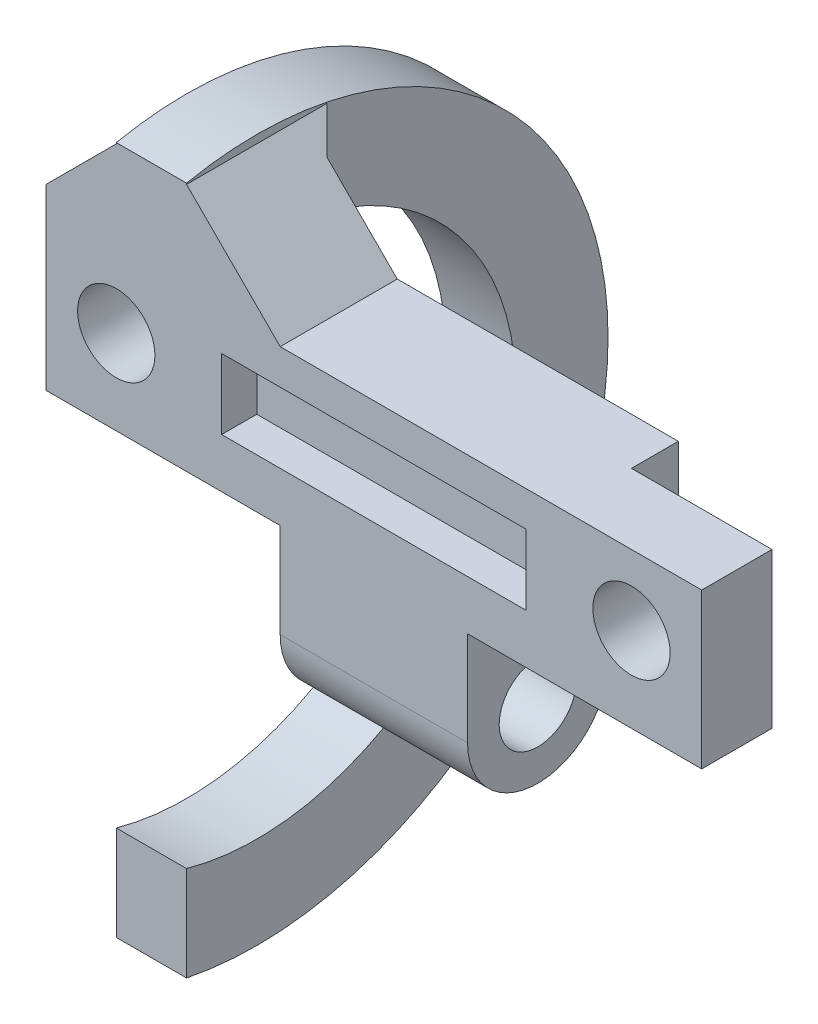
ISO-10303-21;
HEADER;
FILE_DESCRIPTION(('STEP AP214'),'2;1');
FILE_NAME('part.step','',(''),(''),'','','');
FILE_SCHEMA(('AUTOMOTIVE_DESIGN { 1 0 10303 214 1 1 1 1 }'));
ENDSEC;
DATA;
#1=APPLICATION_CONTEXT('core data for automotive mechanical design processes');
#2=APPLICATION_PROTOCOL_DEFINITION('international standard','automotive_design',2000,#1);
#3=PRODUCT_CONTEXT('',#1,'mechanical');
#4=PRODUCT('Part','Part','',(#3));
#5=PRODUCT_RELATED_PRODUCT_CATEGORY('part','',(#4));
#6=PRODUCT_DEFINITION_FORMATION('','',#4);
#7=PRODUCT_DEFINITION_CONTEXT('part definition',#1,'design');
#8=PRODUCT_DEFINITION('design','',#6,#7);
#9=PRODUCT_DEFINITION_SHAPE('','',#8);
#10=(LENGTH_UNIT() NAMED_UNIT(*) SI_UNIT(.MILLI.,.METRE.));
#11=(NAMED_UNIT(*) PLANE_ANGLE_UNIT() SI_UNIT($,.RADIAN.));
#12=(NAMED_UNIT(*) SI_UNIT($,.STERADIAN.) SOLID_ANGLE_UNIT());
#13=UNCERTAINTY_MEASURE_WITH_UNIT(LENGTH_MEASURE(1.E-05),#10,'distance_accuracy_value','');
#14=(GEOMETRIC_REPRESENTATION_CONTEXT(3) GLOBAL_UNCERTAINTY_ASSIGNED_CONTEXT((#13)) GLOBAL_UNIT_ASSIGNED_CONTEXT((#10,
#11,#12)) REPRESENTATION_CONTEXT('',''));
#15=CARTESIAN_POINT('',(0.,0.,0.));
#16=DIRECTION('',(0.,0.,1.));
#17=DIRECTION('',(1.,0.,0.));
#18=AXIS2_PLACEMENT_3D('',#15,#16,#17);
#19=CARTESIAN_POINT('',(4.,-3.61575197548495,-3.16233039336618));
#20=DIRECTION('',(0.,-1.,0.));
#21=DIRECTION('',(0.,0.,-1.));
#22=AXIS2_PLACEMENT_3D('',#19,#20,#21);
#23=PLANE('',#22);
#24=DIRECTION('',(0.,0.,-1.));
#25=VECTOR('',#24,1.);
#26=CARTESIAN_POINT('',(4.,-3.61575197548495,-3.16233039336618));
#27=LINE('',#26,#25);
#28=CARTESIAN_POINT('',(4.,-3.61575197548495,3.));
#29=VERTEX_POINT('',#28);
#30=CARTESIAN_POINT('',(4.,-3.61575197548495,-2.));
#31=VERTEX_POINT('',#30);
#32=EDGE_CURVE('E203',#29,#31,#27,.T.);
#33=ORIENTED_EDGE('',*,*,#32,.T.);
#34=DIRECTION('',(-1.,0.,0.));
#35=VECTOR('',#34,1.);
#36=CARTESIAN_POINT('',(8.,-3.61575197548495,-2.));
#37=LINE('',#36,#35);
#38=CARTESIAN_POINT('',(8.,-3.61575197548495,-2.));
#39=VERTEX_POINT('',#38);
#40=EDGE_CURVE('E207',#39,#31,#37,.T.);
#41=ORIENTED_EDGE('',*,*,#40,.F.);
#42=DIRECTION('',(0.,0.,1.));
#43=VECTOR('',#42,1.);
#44=CARTESIAN_POINT('',(8.,-3.61575197548495,-2.));
#45=LINE('',#44,#43);
#46=CARTESIAN_POINT('',(8.,-3.61575197548495,0.));
#47=VERTEX_POINT('',#46);
#48=EDGE_CURVE('E233',#39,#47,#45,.T.);
#49=ORIENTED_EDGE('',*,*,#48,.T.);
#50=DIRECTION('',(1.,0.,0.));
#51=VECTOR('',#50,1.);
#52=CARTESIAN_POINT('',(4.,-3.61575197548495,0.));
#53=LINE('',#52,#51);
#54=CARTESIAN_POINT('',(14.,-3.61575197548495,0.));
#55=VERTEX_POINT('',#54);
#56=EDGE_CURVE('E322',#47,#55,#53,.T.);
#57=ORIENTED_EDGE('',*,*,#56,.T.);
#58=DIRECTION('',(0.,0.,-1.));
#59=VECTOR('',#58,1.);
#60=CARTESIAN_POINT('',(14.,-3.61575197548495,-3.16233039336618));
#61=LINE('',#60,#59);
#62=CARTESIAN_POINT('',(14.,-3.61575197548495,3.));
#63=VERTEX_POINT('',#62);
#64=EDGE_CURVE('E324',#63,#55,#61,.T.);
#65=ORIENTED_EDGE('',*,*,#64,.F.);
#66=DIRECTION('',(1.,0.,0.));
#67=VECTOR('',#66,1.);
#68=CARTESIAN_POINT('',(4.,-3.61575197548495,3.));
#69=LINE('',#68,#67);
#70=EDGE_CURVE('E209',#29,#63,#69,.T.);
#71=ORIENTED_EDGE('',*,*,#70,.F.);
#72=EDGE_LOOP('',(#33,#41,#49,#57,#65,#71));
#73=FACE_BOUND('',#72,.T.);
#74=ADVANCED_FACE('F33',(#73),#23,.T.);
#75=CARTESIAN_POINT('',(-4.,-3.61575197548495,-2.));
#76=VERTEX_POINT('',#75);
#77=CARTESIAN_POINT('',(-8.,-3.61575197548495,-2.));
#78=VERTEX_POINT('',#77);
#79=EDGE_CURVE('E230',#76,#78,#37,.T.);
#80=ORIENTED_EDGE('',*,*,#79,.F.);
#81=DIRECTION('',(0.,0.,-1.));
#82=VECTOR('',#81,1.);
#83=CARTESIAN_POINT('',(-4.,-3.61575197548495,-3.16233039336618));
#84=LINE('',#83,#82);
#85=CARTESIAN_POINT('',(-4.,-3.61575197548495,3.));
#86=VERTEX_POINT('',#85);
#87=EDGE_CURVE('E48',#86,#76,#84,.T.);
#88=ORIENTED_EDGE('',*,*,#87,.F.);
#89=DIRECTION('',(-1.,0.,0.));
#90=VECTOR('',#89,1.);
#91=CARTESIAN_POINT('',(-4.,-3.61575197548495,3.));
#92=LINE('',#91,#90);
#93=CARTESIAN_POINT('',(-14.,-3.61575197548495,3.));
#94=VERTEX_POINT('',#93);
#95=EDGE_CURVE('E335',#86,#94,#92,.T.);
#96=ORIENTED_EDGE('',*,*,#95,.T.);
#97=DIRECTION('',(0.,0.,-1.));
#98=VECTOR('',#97,1.);
#99=CARTESIAN_POINT('',(-14.,-3.61575197548495,-3.16233039336618));
#100=LINE('',#99,#98);
#101=CARTESIAN_POINT('',(-14.,-3.61575197548495,0.));
#102=VERTEX_POINT('',#101);
#103=EDGE_CURVE('E331',#94,#102,#100,.T.);
#104=ORIENTED_EDGE('',*,*,#103,.T.);
#105=DIRECTION('',(-1.,0.,0.));
#106=VECTOR('',#105,1.);
#107=CARTESIAN_POINT('',(-4.,-3.61575197548495,0.));
#108=LINE('',#107,#106);
#109=CARTESIAN_POINT('',(-8.,-3.61575197548495,0.));
#110=VERTEX_POINT('',#109);
#111=EDGE_CURVE('E314',#110,#102,#108,.T.);
#112=ORIENTED_EDGE('',*,*,#111,.F.);
#113=DIRECTION('',(0.,0.,1.));
#114=VECTOR('',#113,1.);
#115=CARTESIAN_POINT('',(-8.,-3.61575197548495,-2.));
#116=LINE('',#115,#114);
#117=EDGE_CURVE('E229',#78,#110,#116,.T.);
#118=ORIENTED_EDGE('',*,*,#117,.F.);
#119=EDGE_LOOP('',(#80,#88,#96,#104,#112,#118));
#120=FACE_BOUND('',#119,.T.);
#121=ADVANCED_FACE('F467',(#120),#23,.T.);
#122=CARTESIAN_POINT('',(0.,0.,0.));
#123=DIRECTION('',(0.,0.,1.));
#124=DIRECTION('',(1.,0.,0.));
#125=AXIS2_PLACEMENT_3D('',#122,#123,#124);
#126=PLANE('',#125);
#127=CARTESIAN_POINT('',(-11.,0.,0.));
#128=DIRECTION('',(0.,0.,1.));
#129=DIRECTION('',(1.,0.,0.));
#130=AXIS2_PLACEMENT_3D('',#127,#128,#129);
#131=CIRCLE('',#130,1.65);
#132=CARTESIAN_POINT('',(-9.35,0.,0.));
#133=VERTEX_POINT('',#132);
#134=EDGE_CURVE('E346',#133,#133,#131,.T.);
#135=ORIENTED_EDGE('',*,*,#134,.T.);
#136=EDGE_LOOP('',(#135));
#137=FACE_BOUND('',#136,.T.);
#138=DIRECTION('',(-0.707106781186551,-0.707106781186544,0.));
#139=VECTOR('',#138,1.);
#140=CARTESIAN_POINT('',(-8.99999999999996,9.00000000000005,0.));
#141=LINE('',#140,#139);
#142=CARTESIAN_POINT('',(-14.,4.00000000000006,0.));
#143=VERTEX_POINT('',#142);
#144=CARTESIAN_POINT('',(-12.,6.00000000000005,0.));
#145=VERTEX_POINT('',#144);
#146=EDGE_CURVE('E392',#143,#145,#141,.F.);
#147=ORIENTED_EDGE('',*,*,#146,.T.);
#148=DIRECTION('',(0.,-1.,0.));
#149=VECTOR('',#148,1.);
#150=CARTESIAN_POINT('',(-12.,0.,0.));
#151=LINE('',#150,#149);
#152=CARTESIAN_POINT('',(-12.,3.,0.));
#153=VERTEX_POINT('',#152);
#154=EDGE_CURVE('E414',#145,#153,#151,.T.);
#155=ORIENTED_EDGE('',*,*,#154,.T.);
#156=DIRECTION('',(-1.,0.,0.));
#157=VECTOR('',#156,1.);
#158=CARTESIAN_POINT('',(-14.,3.,0.));
#159=LINE('',#158,#157);
#160=CARTESIAN_POINT('',(-8.,3.,0.));
#161=VERTEX_POINT('',#160);
#162=EDGE_CURVE('E55',#161,#153,#159,.T.);
#163=ORIENTED_EDGE('',*,*,#162,.F.);
#164=DIRECTION('',(0.,1.,0.));
#165=VECTOR('',#164,1.);
#166=CARTESIAN_POINT('',(-8.,7.00000000000002,0.));
#167=LINE('',#166,#165);
#168=EDGE_CURVE('E238',#110,#161,#167,.T.);
#169=ORIENTED_EDGE('',*,*,#168,.F.);
#170=ORIENTED_EDGE('',*,*,#111,.T.);
#171=DIRECTION('',(0.,-1.,0.));
#172=VECTOR('',#171,1.);
#173=CARTESIAN_POINT('',(-14.,3.,0.));
#174=LINE('',#173,#172);
#175=EDGE_CURVE('E362',#143,#102,#174,.T.);
#176=ORIENTED_EDGE('',*,*,#175,.F.);
#177=EDGE_LOOP('',(#147,#155,#163,#169,#170,#176));
#178=FACE_BOUND('',#177,.T.);
#179=ADVANCED_FACE('F424',(#137,#178),#126,.F.);
#180=CARTESIAN_POINT('',(11.,0.,0.));
#181=DIRECTION('',(0.,0.,1.));
#182=DIRECTION('',(1.,0.,0.));
#183=AXIS2_PLACEMENT_3D('',#180,#181,#182);
#184=CIRCLE('',#183,1.65);
#185=CARTESIAN_POINT('',(12.65,0.,0.));
#186=VERTEX_POINT('',#185);
#187=EDGE_CURVE('E350',#186,#186,#184,.T.);
#188=ORIENTED_EDGE('',*,*,#187,.T.);
#189=EDGE_LOOP('',(#188));
#190=FACE_BOUND('',#189,.T.);
#191=DIRECTION('',(0.,-1.,0.));
#192=VECTOR('',#191,1.);
#193=CARTESIAN_POINT('',(8.,3.,0.));
#194=LINE('',#193,#192);
#195=CARTESIAN_POINT('',(8.,3.,0.));
#196=VERTEX_POINT('',#195);
#197=EDGE_CURVE('E241',#196,#47,#194,.T.);
#198=ORIENTED_EDGE('',*,*,#197,.F.);
#199=CARTESIAN_POINT('',(14.,3.,0.));
#200=VERTEX_POINT('',#199);
#201=EDGE_CURVE('E369',#200,#196,#159,.T.);
#202=ORIENTED_EDGE('',*,*,#201,.F.);
#203=DIRECTION('',(0.,1.,0.));
#204=VECTOR('',#203,1.);
#205=CARTESIAN_POINT('',(14.,3.,0.));
#206=LINE('',#205,#204);
#207=EDGE_CURVE('E356',#55,#200,#206,.T.);
#208=ORIENTED_EDGE('',*,*,#207,.F.);
#209=ORIENTED_EDGE('',*,*,#56,.F.);
#210=EDGE_LOOP('',(#198,#202,#208,#209));
#211=FACE_BOUND('',#210,.T.);
#212=ADVANCED_FACE('F507',(#190,#211),#126,.F.);
#213=CARTESIAN_POINT('',(-4.,0.,0.));
#214=DIRECTION('',(1.,0.,0.));
#215=DIRECTION('',(0.,0.,-1.));
#216=AXIS2_PLACEMENT_3D('',#213,#214,#215);
#217=PLANE('',#216);
#218=DIRECTION('',(0.,-1.,0.));
#219=VECTOR('',#218,1.);
#220=CARTESIAN_POINT('',(-4.,-3.61575197548495,-2.));
#221=LINE('',#220,#219);
#222=CARTESIAN_POINT('',(-4.,-5.4139320225002,-2.));
#223=VERTEX_POINT('',#222);
#224=EDGE_CURVE('E222',#76,#223,#221,.T.);
#225=ORIENTED_EDGE('',*,*,#224,.T.);
#226=CARTESIAN_POINT('',(-4.,-7.64999999999999,0.));
#227=DIRECTION('',(1.,0.,0.));
#228=DIRECTION('',(0.,0.,-1.));
#229=AXIS2_PLACEMENT_3D('',#226,#227,#228);
#230=CIRCLE('',#229,3.);
#231=CARTESIAN_POINT('',(-4.,-7.65,3.));
#232=VERTEX_POINT('',#231);
#233=EDGE_CURVE('E341',#223,#232,#230,.F.);
#234=ORIENTED_EDGE('',*,*,#233,.T.);
#235=DIRECTION('',(0.,1.,0.));
#236=VECTOR('',#235,1.);
#237=CARTESIAN_POINT('',(-4.,-3.61575197548495,3.));
#238=LINE('',#237,#236);
#239=EDGE_CURVE('E332',#232,#86,#238,.T.);
#240=ORIENTED_EDGE('',*,*,#239,.T.);
#241=ORIENTED_EDGE('',*,*,#87,.T.);
#242=EDGE_LOOP('',(#225,#234,#240,#241));
#243=FACE_BOUND('',#242,.T.);
#244=CARTESIAN_POINT('',(-4.,-7.64999999999999,0.));
#245=DIRECTION('',(1.,0.,0.));
#246=DIRECTION('',(0.,0.,-1.));
#247=AXIS2_PLACEMENT_3D('',#244,#245,#246);
#248=CIRCLE('',#247,1.65);
#249=CARTESIAN_POINT('',(-4.,-7.64999999999999,-1.65));
#250=VERTEX_POINT('',#249);
#251=EDGE_CURVE('E340',#250,#250,#248,.F.);
#252=ORIENTED_EDGE('',*,*,#251,.F.);
#253=EDGE_LOOP('',(#252));
#254=FACE_BOUND('',#253,.T.);
#255=ADVANCED_FACE('F456',(#243,#254),#217,.F.);
#256=CARTESIAN_POINT('',(4.,0.,0.));
#257=DIRECTION('',(-1.,0.,0.));
#258=DIRECTION('',(0.,0.,-1.));
#259=AXIS2_PLACEMENT_3D('',#256,#257,#258);
#260=PLANE('',#259);
#261=DIRECTION('',(0.,1.,0.));
#262=VECTOR('',#261,1.);
#263=CARTESIAN_POINT('',(4.,-3.61575197548495,-2.));
#264=LINE('',#263,#262);
#265=CARTESIAN_POINT('',(4.,-5.41393202250021,-2.));
#266=VERTEX_POINT('',#265);
#267=EDGE_CURVE('E215',#266,#31,#264,.T.);
#268=ORIENTED_EDGE('',*,*,#267,.T.);
#269=ORIENTED_EDGE('',*,*,#32,.F.);
#270=DIRECTION('',(0.,1.,0.));
#271=VECTOR('',#270,1.);
#272=CARTESIAN_POINT('',(4.,-3.61575197548495,3.));
#273=LINE('',#272,#271);
#274=CARTESIAN_POINT('',(4.,-7.65,3.));
#275=VERTEX_POINT('',#274);
#276=EDGE_CURVE('E212',#275,#29,#273,.T.);
#277=ORIENTED_EDGE('',*,*,#276,.F.);
#278=CARTESIAN_POINT('',(4.,-7.65,0.));
#279=DIRECTION('',(-1.,0.,0.));
#280=DIRECTION('',(0.,0.,1.));
#281=AXIS2_PLACEMENT_3D('',#278,#279,#280);
#282=CIRCLE('',#281,3.);
#283=EDGE_CURVE('E219',#275,#266,#282,.F.);
#284=ORIENTED_EDGE('',*,*,#283,.T.);
#285=EDGE_LOOP('',(#268,#269,#277,#284));
#286=FACE_BOUND('',#285,.T.);
#287=CARTESIAN_POINT('',(4.,-7.65,0.));
#288=DIRECTION('',(-1.,0.,0.));
#289=DIRECTION('',(0.,0.,1.));
#290=AXIS2_PLACEMENT_3D('',#287,#288,#289);
#291=CIRCLE('',#290,1.65);
#292=CARTESIAN_POINT('',(4.,-7.65,1.65));
#293=VERTEX_POINT('',#292);
#294=EDGE_CURVE('E329',#293,#293,#291,.F.);
#295=ORIENTED_EDGE('',*,*,#294,.F.);
#296=EDGE_LOOP('',(#295));
#297=FACE_BOUND('',#296,.T.);
#298=ADVANCED_FACE('F216',(#286,#297),#260,.F.);
#299=CARTESIAN_POINT('',(-8.,-7.64999999999999,0.));
#300=DIRECTION('',(-1.,0.,0.));
#301=DIRECTION('',(0.,0.,1.));
#302=AXIS2_PLACEMENT_3D('',#299,#300,#301);
#303=PLANE('',#302);
#304=DIRECTION('',(0.,0.,-1.));
#305=VECTOR('',#304,1.);
#306=CARTESIAN_POINT('',(-8.,7.00000000000002,0.));
#307=LINE('',#306,#305);
#308=CARTESIAN_POINT('',(-8.,7.00000000000002,3.));
#309=VERTEX_POINT('',#308);
#310=CARTESIAN_POINT('',(-8.,7.00000000000002,-3.00000000000001));
#311=VERTEX_POINT('',#310);
#312=EDGE_CURVE('E376',#309,#311,#307,.T.);
#313=ORIENTED_EDGE('',*,*,#312,.T.);
#314=DIRECTION('',(0.,-1.,0.));
#315=VECTOR('',#314,1.);
#316=CARTESIAN_POINT('',(-8.,-7.64999999999999,-3.00000000000001));
#317=LINE('',#316,#315);
#318=CARTESIAN_POINT('',(-8.,3.,-3.));
#319=VERTEX_POINT('',#318);
#320=EDGE_CURVE('E398',#311,#319,#317,.T.);
#321=ORIENTED_EDGE('',*,*,#320,.T.);
#322=CARTESIAN_POINT('',(-8.,-7.64999999999999,0.));
#323=DIRECTION('',(1.,0.,0.));
#324=DIRECTION('',(0.,0.,1.));
#325=AXIS2_PLACEMENT_3D('',#322,#323,#324);
#326=CIRCLE('',#325,11.064470163546);
#327=CARTESIAN_POINT('',(-8.,-18.3,3.));
#328=VERTEX_POINT('',#327);
#329=EDGE_CURVE('E273',#328,#319,#326,.T.);
#330=ORIENTED_EDGE('',*,*,#329,.F.);
#331=DIRECTION('',(0.,1.,0.));
#332=VECTOR('',#331,1.);
#333=CARTESIAN_POINT('',(-8.,-18.3,3.));
#334=LINE('',#333,#332);
#335=CARTESIAN_POINT('',(-8.,-22.3469384566991,3.));
#336=VERTEX_POINT('',#335);
#337=EDGE_CURVE('E270',#336,#328,#334,.T.);
#338=ORIENTED_EDGE('',*,*,#337,.F.);
#339=CARTESIAN_POINT('',(-8.,-7.64999999999999,0.));
#340=DIRECTION('',(-1.,0.,0.));
#341=DIRECTION('',(0.,0.,1.));
#342=AXIS2_PLACEMENT_3D('',#339,#340,#341);
#343=CIRCLE('',#342,15.);
#344=CARTESIAN_POINT('',(-8.,7.04693845669908,3.));
#345=VERTEX_POINT('',#344);
#346=EDGE_CURVE('E267',#345,#336,#343,.T.);
#347=ORIENTED_EDGE('',*,*,#346,.F.);
#348=DIRECTION('',(0.,1.,0.));
#349=VECTOR('',#348,1.);
#350=CARTESIAN_POINT('',(-8.,3.,3.));
#351=LINE('',#350,#349);
#352=EDGE_CURVE('E265',#309,#345,#351,.T.);
#353=ORIENTED_EDGE('',*,*,#352,.F.);
#354=EDGE_LOOP('',(#313,#321,#330,#338,#347,#353));
#355=FACE_BOUND('',#354,.T.);
#356=ADVANCED_FACE('F483',(#355),#303,.F.);
#357=CARTESIAN_POINT('',(-14.,3.,3.));
#358=DIRECTION('',(1.,0.,0.));
#359=DIRECTION('',(0.,0.,-1.));
#360=AXIS2_PLACEMENT_3D('',#357,#358,#359);
#361=PLANE('',#360);
#362=DIRECTION('',(0.,-1.,0.));
#363=VECTOR('',#362,1.);
#364=CARTESIAN_POINT('',(-14.,3.,3.));
#365=LINE('',#364,#363);
#366=CARTESIAN_POINT('',(-14.,4.00000000000006,3.));
#367=VERTEX_POINT('',#366);
#368=EDGE_CURVE('E365',#367,#94,#365,.T.);
#369=ORIENTED_EDGE('',*,*,#368,.F.);
#370=DIRECTION('',(0.,0.,1.));
#371=VECTOR('',#370,1.);
#372=CARTESIAN_POINT('',(-14.,4.00000000000006,3.));
#373=LINE('',#372,#371);
#374=EDGE_CURVE('E389',#367,#143,#373,.F.);
#375=ORIENTED_EDGE('',*,*,#374,.T.);
#376=ORIENTED_EDGE('',*,*,#175,.T.);
#377=ORIENTED_EDGE('',*,*,#103,.F.);
#378=EDGE_LOOP('',(#369,#375,#376,#377));
#379=FACE_BOUND('',#378,.T.);
#380=ADVANCED_FACE('F474',(#379),#361,.F.);
#381=CARTESIAN_POINT('',(0.,0.,3.));
#382=DIRECTION('',(0.,0.,1.));
#383=DIRECTION('',(1.,0.,0.));
#384=AXIS2_PLACEMENT_3D('',#381,#382,#383);
#385=PLANE('',#384);
#386=DIRECTION('',(0.,1.,0.));
#387=VECTOR('',#386,1.);
#388=CARTESIAN_POINT('',(6.5,1.5,3.));
#389=LINE('',#388,#387);
#390=CARTESIAN_POINT('',(6.5,-1.5,3.));
#391=VERTEX_POINT('',#390);
#392=CARTESIAN_POINT('',(6.5,1.5,3.));
#393=VERTEX_POINT('',#392);
#394=EDGE_CURVE('E280',#391,#393,#389,.T.);
#395=ORIENTED_EDGE('',*,*,#394,.F.);
#396=DIRECTION('',(1.,0.,0.));
#397=VECTOR('',#396,1.);
#398=CARTESIAN_POINT('',(-6.5,-1.5,3.));
#399=LINE('',#398,#397);
#400=CARTESIAN_POINT('',(-6.5,-1.5,3.));
#401=VERTEX_POINT('',#400);
#402=EDGE_CURVE('E293',#401,#391,#399,.T.);
#403=ORIENTED_EDGE('',*,*,#402,.F.);
#404=DIRECTION('',(0.,-1.,0.));
#405=VECTOR('',#404,1.);
#406=CARTESIAN_POINT('',(-6.5,1.5,3.));
#407=LINE('',#406,#405);
#408=CARTESIAN_POINT('',(-6.5,1.5,3.));
#409=VERTEX_POINT('',#408);
#410=EDGE_CURVE('E307',#409,#401,#407,.T.);
#411=ORIENTED_EDGE('',*,*,#410,.F.);
#412=DIRECTION('',(-1.,0.,0.));
#413=VECTOR('',#412,1.);
#414=CARTESIAN_POINT('',(-6.5,1.5,3.));
#415=LINE('',#414,#413);
#416=EDGE_CURVE('E304',#393,#409,#415,.T.);
#417=ORIENTED_EDGE('',*,*,#416,.F.);
#418=EDGE_LOOP('',(#395,#403,#411,#417));
#419=FACE_BOUND('',#418,.T.);
#420=CARTESIAN_POINT('',(11.,0.,3.));
#421=DIRECTION('',(0.,0.,1.));
#422=DIRECTION('',(1.,0.,0.));
#423=AXIS2_PLACEMENT_3D('',#420,#421,#422);
#424=CIRCLE('',#423,1.65);
#425=CARTESIAN_POINT('',(12.65,0.,3.));
#426=VERTEX_POINT('',#425);
#427=EDGE_CURVE('E353',#426,#426,#424,.T.);
#428=ORIENTED_EDGE('',*,*,#427,.F.);
#429=EDGE_LOOP('',(#428));
#430=FACE_BOUND('',#429,.T.);
#431=CARTESIAN_POINT('',(-11.,0.,3.));
#432=DIRECTION('',(0.,0.,1.));
#433=DIRECTION('',(1.,0.,0.));
#434=AXIS2_PLACEMENT_3D('',#431,#432,#433);
#435=CIRCLE('',#434,1.65);
#436=CARTESIAN_POINT('',(-9.35,0.,3.));
#437=VERTEX_POINT('',#436);
#438=EDGE_CURVE('E347',#437,#437,#435,.T.);
#439=ORIENTED_EDGE('',*,*,#438,.F.);
#440=EDGE_LOOP('',(#439));
#441=FACE_BOUND('',#440,.T.);
#442=DIRECTION('',(-1.,0.,0.));
#443=VECTOR('',#442,1.);
#444=CARTESIAN_POINT('',(-8.,7.04693845669908,3.));
#445=LINE('',#444,#443);
#446=CARTESIAN_POINT('',(-11.,7.04693845669908,3.));
#447=VERTEX_POINT('',#446);
#448=EDGE_CURVE('E276',#345,#447,#445,.T.);
#449=ORIENTED_EDGE('',*,*,#448,.T.);
#450=DIRECTION('',(0.,-1.,0.));
#451=VECTOR('',#450,1.);
#452=CARTESIAN_POINT('',(-11.,0.,3.));
#453=LINE('',#452,#451);
#454=CARTESIAN_POINT('',(-11.,7.00000000000003,3.));
#455=VERTEX_POINT('',#454);
#456=EDGE_CURVE('E260',#447,#455,#453,.T.);
#457=ORIENTED_EDGE('',*,*,#456,.T.);
#458=DIRECTION('',(0.707106781186551,0.707106781186544,0.));
#459=VECTOR('',#458,1.);
#460=CARTESIAN_POINT('',(-15.0000000000001,3.,3.));
#461=LINE('',#460,#459);
#462=EDGE_CURVE('E395',#455,#367,#461,.F.);
#463=ORIENTED_EDGE('',*,*,#462,.T.);
#464=ORIENTED_EDGE('',*,*,#368,.T.);
#465=ORIENTED_EDGE('',*,*,#95,.F.);
#466=ORIENTED_EDGE('',*,*,#239,.F.);
#467=DIRECTION('',(1.,0.,0.));
#468=VECTOR('',#467,1.);
#469=CARTESIAN_POINT('',(-22.4852813742386,-7.64999999999999,3.));
#470=LINE('',#469,#468);
#471=EDGE_CURVE('E343',#232,#275,#470,.T.);
#472=ORIENTED_EDGE('',*,*,#471,.T.);
#473=ORIENTED_EDGE('',*,*,#276,.T.);
#474=ORIENTED_EDGE('',*,*,#70,.T.);
#475=DIRECTION('',(0.,1.,0.));
#476=VECTOR('',#475,1.);
#477=CARTESIAN_POINT('',(14.,3.,3.));
#478=LINE('',#477,#476);
#479=CARTESIAN_POINT('',(14.,3.,3.));
#480=VERTEX_POINT('',#479);
#481=EDGE_CURVE('E359',#63,#480,#478,.T.);
#482=ORIENTED_EDGE('',*,*,#481,.T.);
#483=DIRECTION('',(-1.,0.,0.));
#484=VECTOR('',#483,1.);
#485=CARTESIAN_POINT('',(-14.,3.,3.));
#486=LINE('',#485,#484);
#487=CARTESIAN_POINT('',(-4.00000000000001,3.,3.));
#488=VERTEX_POINT('',#487);
#489=EDGE_CURVE('E361',#480,#488,#486,.T.);
#490=ORIENTED_EDGE('',*,*,#489,.T.);
#491=DIRECTION('',(0.707106781186545,-0.70710678118655,0.));
#492=VECTOR('',#491,1.);
#493=CARTESIAN_POINT('',(-8.,7.00000000000002,3.));
#494=LINE('',#493,#492);
#495=EDGE_CURVE('E384',#488,#309,#494,.F.);
#496=ORIENTED_EDGE('',*,*,#495,.T.);
#497=ORIENTED_EDGE('',*,*,#352,.T.);
#498=EDGE_LOOP('',(#449,#457,#463,#464,#465,#466,#472,#473,#474,#482,#490,#496,#497));
#499=FACE_BOUND('',#498,.T.);
#500=ADVANCED_FACE('F464',(#419,#430,#441,#499),#385,.T.);
#501=CARTESIAN_POINT('',(-8.,3.,0.));
#502=DIRECTION('',(0.,-1.,0.));
#503=DIRECTION('',(0.,0.,-1.));
#504=AXIS2_PLACEMENT_3D('',#501,#502,#503);
#505=PLANE('',#504);
#506=ORIENTED_EDGE('',*,*,#162,.T.);
#507=DIRECTION('',(0.707106781186543,0.,-0.707106781186552));
#508=VECTOR('',#507,1.);
#509=CARTESIAN_POINT('',(-11.,3.,-1.00000000000001));
#510=LINE('',#509,#508);
#511=CARTESIAN_POINT('',(-11.,3.,-1.00000000000001));
#512=VERTEX_POINT('',#511);
#513=EDGE_CURVE('E11',#153,#512,#510,.T.);
#514=ORIENTED_EDGE('',*,*,#513,.T.);
#515=DIRECTION('',(0.,0.,-1.));
#516=VECTOR('',#515,1.);
#517=CARTESIAN_POINT('',(-11.,3.,-3.));
#518=LINE('',#517,#516);
#519=CARTESIAN_POINT('',(-11.,3.,-3.));
#520=VERTEX_POINT('',#519);
#521=EDGE_CURVE('E253',#512,#520,#518,.T.);
#522=ORIENTED_EDGE('',*,*,#521,.T.);
#523=DIRECTION('',(-1.,0.,0.));
#524=VECTOR('',#523,1.);
#525=CARTESIAN_POINT('',(-8.,3.,-3.));
#526=LINE('',#525,#524);
#527=EDGE_CURVE('E277',#319,#520,#526,.T.);
#528=ORIENTED_EDGE('',*,*,#527,.F.);
#529=DIRECTION('',(0.707106781186543,0.,0.707106781186552));
#530=VECTOR('',#529,1.);
#531=CARTESIAN_POINT('',(-8.,3.,-3.00000000000001));
#532=LINE('',#531,#530);
#533=CARTESIAN_POINT('',(-7.00000000000001,3.,-2.));
#534=VERTEX_POINT('',#533);
#535=EDGE_CURVE('E406',#319,#534,#532,.T.);
#536=ORIENTED_EDGE('',*,*,#535,.T.);
#537=DIRECTION('',(1.,0.,0.));
#538=VECTOR('',#537,1.);
#539=CARTESIAN_POINT('',(-8.,3.,-2.));
#540=LINE('',#539,#538);
#541=CARTESIAN_POINT('',(-8.,3.,-2.));
#542=VERTEX_POINT('',#541);
#543=EDGE_CURVE('E403',#542,#534,#540,.T.);
#544=ORIENTED_EDGE('',*,*,#543,.F.);
#545=DIRECTION('',(0.,0.,1.));
#546=VECTOR('',#545,1.);
#547=CARTESIAN_POINT('',(-8.,3.,0.));
#548=LINE('',#547,#546);
#549=EDGE_CURVE('E263',#542,#161,#548,.T.);
#550=ORIENTED_EDGE('',*,*,#549,.T.);
#551=EDGE_LOOP('',(#506,#514,#522,#528,#536,#544,#550));
#552=FACE_BOUND('',#551,.T.);
#553=ADVANCED_FACE('F427',(#552),#505,.T.);
#554=CARTESIAN_POINT('',(-8.,-7.64999999999999,0.));
#555=DIRECTION('',(-1.,0.,0.));
#556=DIRECTION('',(0.,0.,1.));
#557=AXIS2_PLACEMENT_3D('',#554,#555,#556);
#558=CYLINDRICAL_SURFACE('',#557,11.064470163546);
#559=ORIENTED_EDGE('',*,*,#527,.T.);
#560=CARTESIAN_POINT('',(-11.,-7.64999999999999,0.));
#561=DIRECTION('',(-1.,0.,0.));
#562=DIRECTION('',(0.,0.,1.));
#563=AXIS2_PLACEMENT_3D('',#560,#561,#562);
#564=CIRCLE('',#563,11.064470163546);
#565=CARTESIAN_POINT('',(-11.,-18.3,3.));
#566=VERTEX_POINT('',#565);
#567=EDGE_CURVE('E250',#520,#566,#564,.T.);
#568=ORIENTED_EDGE('',*,*,#567,.T.);
#569=DIRECTION('',(-1.,0.,0.));
#570=VECTOR('',#569,1.);
#571=CARTESIAN_POINT('',(-8.,-18.3,3.));
#572=LINE('',#571,#570);
#573=EDGE_CURVE('E281',#328,#566,#572,.T.);
#574=ORIENTED_EDGE('',*,*,#573,.F.);
#575=ORIENTED_EDGE('',*,*,#329,.T.);
#576=EDGE_LOOP('',(#559,#568,#574,#575));
#577=FACE_BOUND('',#576,.T.);
#578=ADVANCED_FACE('F433',(#577),#558,.F.);
#579=CARTESIAN_POINT('',(-8.,-18.3,3.));
#580=DIRECTION('',(0.,0.,1.));
#581=DIRECTION('',(1.,0.,0.));
#582=AXIS2_PLACEMENT_3D('',#579,#580,#581);
#583=PLANE('',#582);
#584=ORIENTED_EDGE('',*,*,#573,.T.);
#585=DIRECTION('',(0.,-1.,0.));
#586=VECTOR('',#585,1.);
#587=CARTESIAN_POINT('',(-11.,-18.3,3.));
#588=LINE('',#587,#586);
#589=CARTESIAN_POINT('',(-11.,-22.3469384566991,3.));
#590=VERTEX_POINT('',#589);
#591=EDGE_CURVE('E257',#566,#590,#588,.T.);
#592=ORIENTED_EDGE('',*,*,#591,.T.);
#593=DIRECTION('',(-1.,0.,0.));
#594=VECTOR('',#593,1.);
#595=CARTESIAN_POINT('',(-8.,-22.3469384566991,3.));
#596=LINE('',#595,#594);
#597=EDGE_CURVE('E284',#336,#590,#596,.T.);
#598=ORIENTED_EDGE('',*,*,#597,.F.);
#599=ORIENTED_EDGE('',*,*,#337,.T.);
#600=EDGE_LOOP('',(#584,#592,#598,#599));
#601=FACE_BOUND('',#600,.T.);
#602=ADVANCED_FACE('F485',(#601),#583,.T.);
#603=CARTESIAN_POINT('',(-8.,-7.64999999999999,0.));
#604=DIRECTION('',(-1.,0.,0.));
#605=DIRECTION('',(0.,0.,1.));
#606=AXIS2_PLACEMENT_3D('',#603,#604,#605);
#607=CYLINDRICAL_SURFACE('',#606,15.);
#608=ORIENTED_EDGE('',*,*,#597,.T.);
#609=CARTESIAN_POINT('',(-11.,-7.64999999999999,0.));
#610=DIRECTION('',(-1.,0.,0.));
#611=DIRECTION('',(0.,0.,1.));
#612=AXIS2_PLACEMENT_3D('',#609,#610,#611);
#613=CIRCLE('',#612,15.);
#614=EDGE_CURVE('E255',#447,#590,#613,.T.);
#615=ORIENTED_EDGE('',*,*,#614,.F.);
#616=ORIENTED_EDGE('',*,*,#448,.F.);
#617=ORIENTED_EDGE('',*,*,#346,.T.);
#618=EDGE_LOOP('',(#608,#615,#616,#617));
#619=FACE_BOUND('',#618,.T.);
#620=ADVANCED_FACE('F480',(#619),#607,.T.);
#621=CARTESIAN_POINT('',(-14.,3.,3.));
#622=DIRECTION('',(0.,-1.,0.));
#623=DIRECTION('',(0.,0.,-1.));
#624=AXIS2_PLACEMENT_3D('',#621,#622,#623);
#625=PLANE('',#624);
#626=ORIENTED_EDGE('',*,*,#201,.T.);
#627=DIRECTION('',(0.,0.,1.));
#628=VECTOR('',#627,1.);
#629=CARTESIAN_POINT('',(8.,3.,-2.));
#630=LINE('',#629,#628);
#631=CARTESIAN_POINT('',(8.,3.,-2.));
#632=VERTEX_POINT('',#631);
#633=EDGE_CURVE('E247',#632,#196,#630,.T.);
#634=ORIENTED_EDGE('',*,*,#633,.F.);
#635=DIRECTION('',(1.,0.,0.));
#636=VECTOR('',#635,1.);
#637=CARTESIAN_POINT('',(8.,3.,-2.));
#638=LINE('',#637,#636);
#639=CARTESIAN_POINT('',(-4.00000000000001,3.,-2.));
#640=VERTEX_POINT('',#639);
#641=EDGE_CURVE('E450',#640,#632,#638,.T.);
#642=ORIENTED_EDGE('',*,*,#641,.F.);
#643=DIRECTION('',(0.,0.,1.));
#644=VECTOR('',#643,1.);
#645=CARTESIAN_POINT('',(-4.00000000000001,3.,3.));
#646=LINE('',#645,#644);
#647=EDGE_CURVE('E382',#640,#488,#646,.T.);
#648=ORIENTED_EDGE('',*,*,#647,.T.);
#649=ORIENTED_EDGE('',*,*,#489,.F.);
#650=DIRECTION('',(0.,0.,-1.));
#651=VECTOR('',#650,1.);
#652=CARTESIAN_POINT('',(14.,3.,3.));
#653=LINE('',#652,#651);
#654=EDGE_CURVE('E367',#480,#200,#653,.T.);
#655=ORIENTED_EDGE('',*,*,#654,.T.);
#656=EDGE_LOOP('',(#626,#634,#642,#648,#649,#655));
#657=FACE_BOUND('',#656,.T.);
#658=ADVANCED_FACE('F492',(#657),#625,.F.);
#659=CARTESIAN_POINT('',(14.,3.,3.));
#660=DIRECTION('',(-1.,0.,0.));
#661=DIRECTION('',(0.,-1.,0.));
#662=AXIS2_PLACEMENT_3D('',#659,#660,#661);
#663=PLANE('',#662);
#664=ORIENTED_EDGE('',*,*,#64,.T.);
#665=ORIENTED_EDGE('',*,*,#207,.T.);
#666=ORIENTED_EDGE('',*,*,#654,.F.);
#667=ORIENTED_EDGE('',*,*,#481,.F.);
#668=EDGE_LOOP('',(#664,#665,#666,#667));
#669=FACE_BOUND('',#668,.T.);
#670=ADVANCED_FACE('F522',(#669),#663,.F.);
#671=CARTESIAN_POINT('',(11.,0.,3.));
#672=DIRECTION('',(0.,0.,-1.));
#673=DIRECTION('',(-1.,0.,0.));
#674=AXIS2_PLACEMENT_3D('',#671,#672,#673);
#675=CYLINDRICAL_SURFACE('',#674,1.65);
#676=ORIENTED_EDGE('',*,*,#427,.T.);
#677=EDGE_LOOP('',(#676));
#678=FACE_BOUND('',#677,.T.);
#679=ORIENTED_EDGE('',*,*,#187,.F.);
#680=EDGE_LOOP('',(#679));
#681=FACE_BOUND('',#680,.T.);
#682=ADVANCED_FACE('F518',(#678,#681),#675,.F.);
#683=CARTESIAN_POINT('',(-11.,0.,3.));
#684=DIRECTION('',(0.,0.,-1.));
#685=DIRECTION('',(-1.,0.,0.));
#686=AXIS2_PLACEMENT_3D('',#683,#684,#685);
#687=CYLINDRICAL_SURFACE('',#686,1.65);
#688=ORIENTED_EDGE('',*,*,#438,.T.);
#689=EDGE_LOOP('',(#688));
#690=FACE_BOUND('',#689,.T.);
#691=ORIENTED_EDGE('',*,*,#134,.F.);
#692=EDGE_LOOP('',(#691));
#693=FACE_BOUND('',#692,.T.);
#694=ADVANCED_FACE('F515',(#690,#693),#687,.F.);
#695=CARTESIAN_POINT('',(-22.4852813742386,-7.64999999999999,0.));
#696=DIRECTION('',(1.,0.,0.));
#697=DIRECTION('',(0.,1.,0.));
#698=AXIS2_PLACEMENT_3D('',#695,#696,#697);
#699=CYLINDRICAL_SURFACE('',#698,3.);
#700=DIRECTION('',(1.,0.,0.));
#701=VECTOR('',#700,1.);
#702=CARTESIAN_POINT('',(-22.4852813742386,-5.4139320225002,-2.));
#703=LINE('',#702,#701);
#704=EDGE_CURVE('E242',#266,#223,#703,.F.);
#705=ORIENTED_EDGE('',*,*,#704,.F.);
#706=ORIENTED_EDGE('',*,*,#283,.F.);
#707=ORIENTED_EDGE('',*,*,#471,.F.);
#708=ORIENTED_EDGE('',*,*,#233,.F.);
#709=EDGE_LOOP('',(#705,#706,#707,#708));
#710=FACE_BOUND('',#709,.T.);
#711=ADVANCED_FACE('F462',(#710),#699,.T.);
#712=CARTESIAN_POINT('',(-22.4852813742386,-7.64999999999999,0.));
#713=DIRECTION('',(1.,0.,0.));
#714=DIRECTION('',(0.,1.,0.));
#715=AXIS2_PLACEMENT_3D('',#712,#713,#714);
#716=CYLINDRICAL_SURFACE('',#715,1.65);
#717=ORIENTED_EDGE('',*,*,#294,.T.);
#718=EDGE_LOOP('',(#717));
#719=FACE_BOUND('',#718,.T.);
#720=ORIENTED_EDGE('',*,*,#251,.T.);
#721=EDGE_LOOP('',(#720));
#722=FACE_BOUND('',#721,.T.);
#723=ADVANCED_FACE('F508',(#719,#722),#716,.F.);
#724=CARTESIAN_POINT('',(6.5,1.5,1.5));
#725=DIRECTION('',(1.,0.,0.));
#726=DIRECTION('',(0.,0.,-1.));
#727=AXIS2_PLACEMENT_3D('',#724,#725,#726);
#728=PLANE('',#727);
#729=ORIENTED_EDGE('',*,*,#394,.T.);
#730=DIRECTION('',(0.,0.,1.));
#731=VECTOR('',#730,1.);
#732=CARTESIAN_POINT('',(6.5,1.5,1.5));
#733=LINE('',#732,#731);
#734=CARTESIAN_POINT('',(6.5,1.5,1.5));
#735=VERTEX_POINT('',#734);
#736=EDGE_CURVE('E302',#735,#393,#733,.T.);
#737=ORIENTED_EDGE('',*,*,#736,.F.);
#738=DIRECTION('',(0.,1.,0.));
#739=VECTOR('',#738,1.);
#740=CARTESIAN_POINT('',(6.5,1.5,1.5));
#741=LINE('',#740,#739);
#742=CARTESIAN_POINT('',(6.5,-1.5,1.5));
#743=VERTEX_POINT('',#742);
#744=EDGE_CURVE('E289',#743,#735,#741,.T.);
#745=ORIENTED_EDGE('',*,*,#744,.F.);
#746=DIRECTION('',(0.,0.,1.));
#747=VECTOR('',#746,1.);
#748=CARTESIAN_POINT('',(6.5,-1.5,1.5));
#749=LINE('',#748,#747);
#750=EDGE_CURVE('E312',#743,#391,#749,.T.);
#751=ORIENTED_EDGE('',*,*,#750,.T.);
#752=EDGE_LOOP('',(#729,#737,#745,#751));
#753=FACE_BOUND('',#752,.T.);
#754=ADVANCED_FACE('F511',(#753),#728,.F.);
#755=CARTESIAN_POINT('',(-6.5,-1.5,1.5));
#756=DIRECTION('',(0.,-1.,0.));
#757=DIRECTION('',(0.,0.,-1.));
#758=AXIS2_PLACEMENT_3D('',#755,#756,#757);
#759=PLANE('',#758);
#760=ORIENTED_EDGE('',*,*,#402,.T.);
#761=ORIENTED_EDGE('',*,*,#750,.F.);
#762=DIRECTION('',(1.,0.,0.));
#763=VECTOR('',#762,1.);
#764=CARTESIAN_POINT('',(-6.5,-1.5,1.5));
#765=LINE('',#764,#763);
#766=CARTESIAN_POINT('',(-6.5,-1.5,1.5));
#767=VERTEX_POINT('',#766);
#768=EDGE_CURVE('E299',#767,#743,#765,.T.);
#769=ORIENTED_EDGE('',*,*,#768,.F.);
#770=DIRECTION('',(0.,0.,1.));
#771=VECTOR('',#770,1.);
#772=CARTESIAN_POINT('',(-6.5,-1.5,1.5));
#773=LINE('',#772,#771);
#774=EDGE_CURVE('E315',#767,#401,#773,.T.);
#775=ORIENTED_EDGE('',*,*,#774,.T.);
#776=EDGE_LOOP('',(#760,#761,#769,#775));
#777=FACE_BOUND('',#776,.T.);
#778=ADVANCED_FACE('F720',(#777),#759,.F.);
#779=CARTESIAN_POINT('',(-6.5,1.5,1.5));
#780=DIRECTION('',(-1.,0.,0.));
#781=DIRECTION('',(0.,0.,1.));
#782=AXIS2_PLACEMENT_3D('',#779,#780,#781);
#783=PLANE('',#782);
#784=ORIENTED_EDGE('',*,*,#410,.T.);
#785=ORIENTED_EDGE('',*,*,#774,.F.);
#786=DIRECTION('',(0.,-1.,0.));
#787=VECTOR('',#786,1.);
#788=CARTESIAN_POINT('',(-6.5,1.5,1.5));
#789=LINE('',#788,#787);
#790=CARTESIAN_POINT('',(-6.5,1.5,1.5));
#791=VERTEX_POINT('',#790);
#792=EDGE_CURVE('E296',#791,#767,#789,.T.);
#793=ORIENTED_EDGE('',*,*,#792,.F.);
#794=DIRECTION('',(0.,0.,1.));
#795=VECTOR('',#794,1.);
#796=CARTESIAN_POINT('',(-6.5,1.5,1.5));
#797=LINE('',#796,#795);
#798=EDGE_CURVE('E317',#791,#409,#797,.T.);
#799=ORIENTED_EDGE('',*,*,#798,.T.);
#800=EDGE_LOOP('',(#784,#785,#793,#799));
#801=FACE_BOUND('',#800,.T.);
#802=ADVANCED_FACE('F710',(#801),#783,.F.);
#803=CARTESIAN_POINT('',(-6.5,1.5,1.5));
#804=DIRECTION('',(0.,1.,0.));
#805=DIRECTION('',(0.,0.,1.));
#806=AXIS2_PLACEMENT_3D('',#803,#804,#805);
#807=PLANE('',#806);
#808=ORIENTED_EDGE('',*,*,#416,.T.);
#809=ORIENTED_EDGE('',*,*,#798,.F.);
#810=DIRECTION('',(-1.,0.,0.));
#811=VECTOR('',#810,1.);
#812=CARTESIAN_POINT('',(-6.5,1.5,1.5));
#813=LINE('',#812,#811);
#814=EDGE_CURVE('E292',#735,#791,#813,.T.);
#815=ORIENTED_EDGE('',*,*,#814,.F.);
#816=ORIENTED_EDGE('',*,*,#736,.T.);
#817=EDGE_LOOP('',(#808,#809,#815,#816));
#818=FACE_BOUND('',#817,.T.);
#819=ADVANCED_FACE('F700',(#818),#807,.F.);
#820=CARTESIAN_POINT('',(0.,0.,1.5));
#821=DIRECTION('',(0.,0.,1.));
#822=DIRECTION('',(1.,0.,0.));
#823=AXIS2_PLACEMENT_3D('',#820,#821,#822);
#824=PLANE('',#823);
#825=ORIENTED_EDGE('',*,*,#744,.T.);
#826=ORIENTED_EDGE('',*,*,#814,.T.);
#827=ORIENTED_EDGE('',*,*,#792,.T.);
#828=ORIENTED_EDGE('',*,*,#768,.T.);
#829=EDGE_LOOP('',(#825,#826,#827,#828));
#830=FACE_BOUND('',#829,.T.);
#831=ADVANCED_FACE('F558',(#830),#824,.T.);
#832=CARTESIAN_POINT('',(-11.,-7.64999999999999,0.));
#833=DIRECTION('',(-1.,0.,0.));
#834=DIRECTION('',(0.,0.,1.));
#835=AXIS2_PLACEMENT_3D('',#832,#833,#834);
#836=PLANE('',#835);
#837=ORIENTED_EDGE('',*,*,#521,.F.);
#838=DIRECTION('',(0.,1.,0.));
#839=VECTOR('',#838,1.);
#840=CARTESIAN_POINT('',(-11.,-7.64999999999999,-1.00000000000001));
#841=LINE('',#840,#839);
#842=CARTESIAN_POINT('',(-11.,7.00000000000003,-1.00000000000001));
#843=VERTEX_POINT('',#842);
#844=EDGE_CURVE('E411',#512,#843,#841,.T.);
#845=ORIENTED_EDGE('',*,*,#844,.T.);
#846=DIRECTION('',(0.,0.,1.));
#847=VECTOR('',#846,1.);
#848=CARTESIAN_POINT('',(-11.,7.00000000000003,3.));
#849=LINE('',#848,#847);
#850=EDGE_CURVE('E386',#843,#455,#849,.T.);
#851=ORIENTED_EDGE('',*,*,#850,.T.);
#852=ORIENTED_EDGE('',*,*,#456,.F.);
#853=ORIENTED_EDGE('',*,*,#614,.T.);
#854=ORIENTED_EDGE('',*,*,#591,.F.);
#855=ORIENTED_EDGE('',*,*,#567,.F.);
#856=EDGE_LOOP('',(#837,#845,#851,#852,#853,#854,#855));
#857=FACE_BOUND('',#856,.T.);
#858=ADVANCED_FACE('F431',(#857),#836,.T.);
#859=CARTESIAN_POINT('',(-8.,7.00000000000002,0.));
#860=DIRECTION('',(0.70710678118655,0.707106781186545,0.));
#861=DIRECTION('',(0.,0.,1.));
#862=AXIS2_PLACEMENT_3D('',#859,#860,#861);
#863=PLANE('',#862);
#864=ORIENTED_EDGE('',*,*,#495,.F.);
#865=ORIENTED_EDGE('',*,*,#647,.F.);
#866=DIRECTION('',(0.707106781186545,-0.70710678118655,0.));
#867=VECTOR('',#866,1.);
#868=CARTESIAN_POINT('',(-4.00000000000001,3.,-2.));
#869=LINE('',#868,#867);
#870=CARTESIAN_POINT('',(-7.00000000000001,6.00000000000002,-2.));
#871=VERTEX_POINT('',#870);
#872=EDGE_CURVE('E448',#871,#640,#869,.T.);
#873=ORIENTED_EDGE('',*,*,#872,.F.);
#874=DIRECTION('',(0.577350269189621,-0.577350269189626,0.57735026918963));
#875=VECTOR('',#874,1.);
#876=CARTESIAN_POINT('',(-7.,6.00000000000001,-1.99999999999999));
#877=LINE('',#876,#875);
#878=EDGE_CURVE('E408',#871,#311,#877,.F.);
#879=ORIENTED_EDGE('',*,*,#878,.T.);
#880=ORIENTED_EDGE('',*,*,#312,.F.);
#881=EDGE_LOOP('',(#864,#865,#873,#879,#880));
#882=FACE_BOUND('',#881,.T.);
#883=ADVANCED_FACE('F446',(#882),#863,.T.);
#884=CARTESIAN_POINT('',(-15.0000000000001,3.,-3.));
#885=DIRECTION('',(-0.707106781186544,0.707106781186551,0.));
#886=DIRECTION('',(0.,0.,1.));
#887=AXIS2_PLACEMENT_3D('',#884,#885,#886);
#888=PLANE('',#887);
#889=ORIENTED_EDGE('',*,*,#462,.F.);
#890=ORIENTED_EDGE('',*,*,#850,.F.);
#891=DIRECTION('',(0.577350269189625,0.577350269189619,-0.577350269189633));
#892=VECTOR('',#891,1.);
#893=CARTESIAN_POINT('',(-13.,5.00000000000004,1.00000000000003));
#894=LINE('',#893,#892);
#895=EDGE_CURVE('E41',#843,#145,#894,.F.);
#896=ORIENTED_EDGE('',*,*,#895,.T.);
#897=ORIENTED_EDGE('',*,*,#146,.F.);
#898=ORIENTED_EDGE('',*,*,#374,.F.);
#899=EDGE_LOOP('',(#889,#890,#896,#897,#898));
#900=FACE_BOUND('',#899,.T.);
#901=ADVANCED_FACE('F418',(#900),#888,.T.);
#902=CARTESIAN_POINT('',(-8.,7.00000000000002,-2.));
#903=DIRECTION('',(1.,0.,0.));
#904=DIRECTION('',(0.,0.,-1.));
#905=AXIS2_PLACEMENT_3D('',#902,#903,#904);
#906=PLANE('',#905);
#907=ORIENTED_EDGE('',*,*,#549,.F.);
#908=DIRECTION('',(0.,1.,0.));
#909=VECTOR('',#908,1.);
#910=CARTESIAN_POINT('',(-8.,3.61575197548495,-2.));
#911=LINE('',#910,#909);
#912=EDGE_CURVE('E244',#78,#542,#911,.T.);
#913=ORIENTED_EDGE('',*,*,#912,.F.);
#914=ORIENTED_EDGE('',*,*,#117,.T.);
#915=ORIENTED_EDGE('',*,*,#168,.T.);
#916=EDGE_LOOP('',(#907,#913,#914,#915));
#917=FACE_BOUND('',#916,.T.);
#918=ADVANCED_FACE('F472',(#917),#906,.F.);
#919=CARTESIAN_POINT('',(8.,3.,-2.));
#920=DIRECTION('',(-1.,0.,0.));
#921=DIRECTION('',(0.,0.,1.));
#922=AXIS2_PLACEMENT_3D('',#919,#920,#921);
#923=PLANE('',#922);
#924=ORIENTED_EDGE('',*,*,#197,.T.);
#925=ORIENTED_EDGE('',*,*,#48,.F.);
#926=DIRECTION('',(0.,-1.,0.));
#927=VECTOR('',#926,1.);
#928=CARTESIAN_POINT('',(8.,3.,-2.));
#929=LINE('',#928,#927);
#930=EDGE_CURVE('E227',#632,#39,#929,.T.);
#931=ORIENTED_EDGE('',*,*,#930,.F.);
#932=ORIENTED_EDGE('',*,*,#633,.T.);
#933=EDGE_LOOP('',(#924,#925,#931,#932));
#934=FACE_BOUND('',#933,.T.);
#935=ADVANCED_FACE('F546',(#934),#923,.F.);
#936=CARTESIAN_POINT('',(0.,0.,-2.));
#937=DIRECTION('',(0.,0.,-1.));
#938=DIRECTION('',(-1.,0.,0.));
#939=AXIS2_PLACEMENT_3D('',#936,#937,#938);
#940=PLANE('',#939);
#941=ORIENTED_EDGE('',*,*,#912,.T.);
#942=ORIENTED_EDGE('',*,*,#543,.T.);
#943=DIRECTION('',(0.,1.,0.));
#944=VECTOR('',#943,1.);
#945=CARTESIAN_POINT('',(-7.00000000000001,0.,-2.));
#946=LINE('',#945,#944);
#947=EDGE_CURVE('E401',#534,#871,#946,.T.);
#948=ORIENTED_EDGE('',*,*,#947,.T.);
#949=ORIENTED_EDGE('',*,*,#872,.T.);
#950=ORIENTED_EDGE('',*,*,#641,.T.);
#951=ORIENTED_EDGE('',*,*,#930,.T.);
#952=ORIENTED_EDGE('',*,*,#40,.T.);
#953=ORIENTED_EDGE('',*,*,#267,.F.);
#954=ORIENTED_EDGE('',*,*,#704,.T.);
#955=ORIENTED_EDGE('',*,*,#224,.F.);
#956=ORIENTED_EDGE('',*,*,#79,.T.);
#957=EDGE_LOOP('',(#941,#942,#948,#949,#950,#951,#952,#953,#954,#955,#956));
#958=FACE_BOUND('',#957,.T.);
#959=ADVANCED_FACE('F225',(#958),#940,.T.);
#960=CARTESIAN_POINT('',(-8.,-7.64999999999999,-3.00000000000001));
#961=DIRECTION('',(-0.707106781186552,0.,0.707106781186543));
#962=DIRECTION('',(0.,-1.,0.));
#963=AXIS2_PLACEMENT_3D('',#960,#961,#962);
#964=PLANE('',#963);
#965=ORIENTED_EDGE('',*,*,#878,.F.);
#966=ORIENTED_EDGE('',*,*,#947,.F.);
#967=ORIENTED_EDGE('',*,*,#535,.F.);
#968=ORIENTED_EDGE('',*,*,#320,.F.);
#969=EDGE_LOOP('',(#965,#966,#967,#968));
#970=FACE_BOUND('',#969,.T.);
#971=ADVANCED_FACE('F442',(#970),#964,.F.);
#972=CARTESIAN_POINT('',(-11.,-7.64999999999999,-1.00000000000001));
#973=DIRECTION('',(0.707106781186552,0.,0.707106781186543));
#974=DIRECTION('',(0.,1.,0.));
#975=AXIS2_PLACEMENT_3D('',#972,#973,#974);
#976=PLANE('',#975);
#977=ORIENTED_EDGE('',*,*,#513,.F.);
#978=ORIENTED_EDGE('',*,*,#154,.F.);
#979=ORIENTED_EDGE('',*,*,#895,.F.);
#980=ORIENTED_EDGE('',*,*,#844,.F.);
#981=EDGE_LOOP('',(#977,#978,#979,#980));
#982=FACE_BOUND('',#981,.T.);
#983=ADVANCED_FACE('F35',(#982),#976,.F.);
#984=CLOSED_SHELL('',(#74,#121,#179,#212,#255,#298,#356,#380,#500,#553,#578,#602,#620,#658,#670,
#682,#694,#711,#723,#754,#778,#802,#819,#831,#858,#883,#901,#918,#935,#959,#971,#983));
#985=MANIFOLD_SOLID_BREP('B2',#984);
#986=ADVANCED_BREP_SHAPE_REPRESENTATION('',(#18,#985),#14);
#987=SHAPE_DEFINITION_REPRESENTATION(#9,#986);
ENDSEC;
END-ISO-10303-21;
